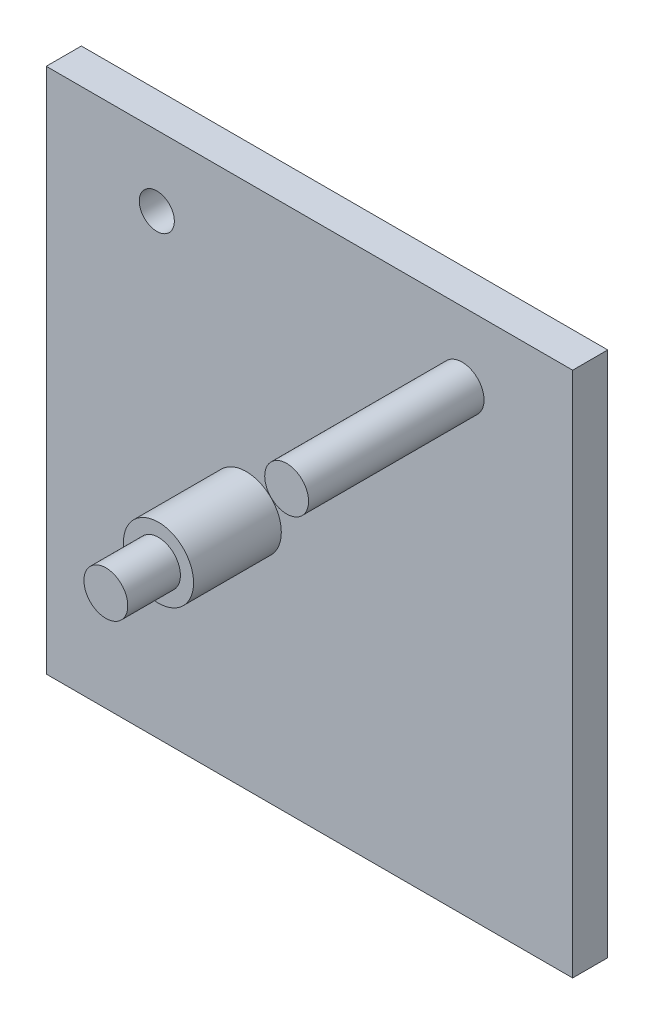
ISO-10303-21;
HEADER;
FILE_DESCRIPTION(('STEP AP214'),'2;1');
FILE_NAME('part.step','',(''),(''),'','','');
FILE_SCHEMA(('AUTOMOTIVE_DESIGN { 1 0 10303 214 1 1 1 1 }'));
ENDSEC;
DATA;
#1=APPLICATION_CONTEXT('core data for automotive mechanical design processes');
#2=APPLICATION_PROTOCOL_DEFINITION('international standard','automotive_design',2000,#1);
#3=PRODUCT_CONTEXT('',#1,'mechanical');
#4=PRODUCT('Part','Part','',(#3));
#5=PRODUCT_RELATED_PRODUCT_CATEGORY('part','',(#4));
#6=PRODUCT_DEFINITION_FORMATION('','',#4);
#7=PRODUCT_DEFINITION_CONTEXT('part definition',#1,'design');
#8=PRODUCT_DEFINITION('design','',#6,#7);
#9=PRODUCT_DEFINITION_SHAPE('','',#8);
#10=(LENGTH_UNIT() NAMED_UNIT(*) SI_UNIT(.MILLI.,.METRE.));
#11=(NAMED_UNIT(*) PLANE_ANGLE_UNIT() SI_UNIT($,.RADIAN.));
#12=(NAMED_UNIT(*) SI_UNIT($,.STERADIAN.) SOLID_ANGLE_UNIT());
#13=UNCERTAINTY_MEASURE_WITH_UNIT(LENGTH_MEASURE(1.E-05),#10,'distance_accuracy_value','');
#14=(GEOMETRIC_REPRESENTATION_CONTEXT(3) GLOBAL_UNCERTAINTY_ASSIGNED_CONTEXT((#13)) GLOBAL_UNIT_ASSIGNED_CONTEXT((#10,
#11,#12)) REPRESENTATION_CONTEXT('',''));
#15=CARTESIAN_POINT('',(0.,0.,0.));
#16=DIRECTION('',(0.,0.,1.));
#17=DIRECTION('',(1.,0.,0.));
#18=AXIS2_PLACEMENT_3D('',#15,#16,#17);
#19=CARTESIAN_POINT('',(-23.6266456506603,3.86953703698112,15.24));
#20=DIRECTION('',(0.,0.,-1.));
#21=DIRECTION('',(-1.,0.,0.));
#22=AXIS2_PLACEMENT_3D('',#19,#20,#21);
#23=CYLINDRICAL_SURFACE('',#22,1.5875);
#24=CARTESIAN_POINT('',(-23.6266456506603,3.86953703698112,8.89));
#25=DIRECTION('',(0.,0.,1.));
#26=DIRECTION('',(1.,0.,0.));
#27=AXIS2_PLACEMENT_3D('',#24,#25,#26);
#28=CIRCLE('',#27,1.5875);
#29=CARTESIAN_POINT('',(-25.2141456506603,3.86953703698112,8.89));
#30=VERTEX_POINT('',#29);
#31=EDGE_CURVE('E42',#30,#30,#28,.T.);
#32=CARTESIAN_POINT('',(-23.6266456506603,3.86953703698112,12.7));
#33=DIRECTION('',(0.,0.,1.));
#34=DIRECTION('',(1.,0.,0.));
#35=AXIS2_PLACEMENT_3D('',#32,#33,#34);
#36=CIRCLE('',#35,1.5875);
#37=CARTESIAN_POINT('',(-25.2141456506603,3.86953703698112,12.7));
#38=VERTEX_POINT('',#37);
#39=EDGE_CURVE('E150',#38,#38,#36,.T.);
#40=CARTESIAN_POINT('',(-25.2141456506603,3.86953703698112,8.89));
#41=CARTESIAN_POINT('',(-25.2141456506603,3.86953703698112,8.9296875));
#42=CARTESIAN_POINT('',(-25.2141456506603,3.86953703698112,8.969375));
#43=CARTESIAN_POINT('',(-25.2141456506603,3.86953703698112,9.04875));
#44=CARTESIAN_POINT('',(-25.2141456506603,3.86953703698112,9.0884375));
#45=CARTESIAN_POINT('',(-25.2141456506603,3.86953703698112,9.1678125));
#46=CARTESIAN_POINT('',(-25.2141456506603,3.86953703698112,9.2075));
#47=CARTESIAN_POINT('',(-25.2141456506603,3.86953703698112,9.286875));
#48=CARTESIAN_POINT('',(-25.2141456506603,3.86953703698112,9.3265625));
#49=CARTESIAN_POINT('',(-25.2141456506603,3.86953703698112,9.4059375));
#50=CARTESIAN_POINT('',(-25.2141456506603,3.86953703698112,9.445625));
#51=CARTESIAN_POINT('',(-25.2141456506603,3.86953703698112,9.525));
#52=CARTESIAN_POINT('',(-25.2141456506603,3.86953703698112,9.5646875));
#53=CARTESIAN_POINT('',(-25.2141456506603,3.86953703698112,9.6440625));
#54=CARTESIAN_POINT('',(-25.2141456506603,3.86953703698112,9.68375));
#55=CARTESIAN_POINT('',(-25.2141456506603,3.86953703698112,9.763125));
#56=CARTESIAN_POINT('',(-25.2141456506603,3.86953703698112,9.8028125));
#57=CARTESIAN_POINT('',(-25.2141456506603,3.86953703698112,9.8821875));
#58=CARTESIAN_POINT('',(-25.2141456506603,3.86953703698112,9.921875));
#59=CARTESIAN_POINT('',(-25.2141456506603,3.86953703698112,10.00125));
#60=CARTESIAN_POINT('',(-25.2141456506603,3.86953703698112,10.0409375));
#61=CARTESIAN_POINT('',(-25.2141456506603,3.86953703698112,10.1203125));
#62=CARTESIAN_POINT('',(-25.2141456506603,3.86953703698112,10.16));
#63=CARTESIAN_POINT('',(-25.2141456506603,3.86953703698112,10.239375));
#64=CARTESIAN_POINT('',(-25.2141456506603,3.86953703698112,10.2790625));
#65=CARTESIAN_POINT('',(-25.2141456506603,3.86953703698112,10.3584375));
#66=CARTESIAN_POINT('',(-25.2141456506603,3.86953703698112,10.398125));
#67=CARTESIAN_POINT('',(-25.2141456506603,3.86953703698112,10.4775));
#68=CARTESIAN_POINT('',(-25.2141456506603,3.86953703698112,10.5171875));
#69=CARTESIAN_POINT('',(-25.2141456506603,3.86953703698112,10.5965625));
#70=CARTESIAN_POINT('',(-25.2141456506603,3.86953703698112,10.63625));
#71=CARTESIAN_POINT('',(-25.2141456506603,3.86953703698112,10.715625));
#72=CARTESIAN_POINT('',(-25.2141456506603,3.86953703698112,10.7553125));
#73=CARTESIAN_POINT('',(-25.2141456506603,3.86953703698112,10.8346875));
#74=CARTESIAN_POINT('',(-25.2141456506603,3.86953703698112,10.874375));
#75=CARTESIAN_POINT('',(-25.2141456506603,3.86953703698112,10.95375));
#76=CARTESIAN_POINT('',(-25.2141456506603,3.86953703698112,10.9934375));
#77=CARTESIAN_POINT('',(-25.2141456506603,3.86953703698112,11.0728125));
#78=CARTESIAN_POINT('',(-25.2141456506603,3.86953703698112,11.1125));
#79=CARTESIAN_POINT('',(-25.2141456506603,3.86953703698112,11.191875));
#80=CARTESIAN_POINT('',(-25.2141456506603,3.86953703698112,11.2315625));
#81=CARTESIAN_POINT('',(-25.2141456506603,3.86953703698112,11.3109375));
#82=CARTESIAN_POINT('',(-25.2141456506603,3.86953703698112,11.350625));
#83=CARTESIAN_POINT('',(-25.2141456506603,3.86953703698112,11.43));
#84=CARTESIAN_POINT('',(-25.2141456506603,3.86953703698112,11.4696875));
#85=CARTESIAN_POINT('',(-25.2141456506603,3.86953703698112,11.5490625));
#86=CARTESIAN_POINT('',(-25.2141456506603,3.86953703698112,11.58875));
#87=CARTESIAN_POINT('',(-25.2141456506603,3.86953703698112,11.668125));
#88=CARTESIAN_POINT('',(-25.2141456506603,3.86953703698112,11.7078125));
#89=CARTESIAN_POINT('',(-25.2141456506603,3.86953703698112,11.7871875));
#90=CARTESIAN_POINT('',(-25.2141456506603,3.86953703698112,11.826875));
#91=CARTESIAN_POINT('',(-25.2141456506603,3.86953703698112,11.90625));
#92=CARTESIAN_POINT('',(-25.2141456506603,3.86953703698112,11.9459375));
#93=CARTESIAN_POINT('',(-25.2141456506603,3.86953703698112,12.0253125));
#94=CARTESIAN_POINT('',(-25.2141456506603,3.86953703698112,12.065));
#95=CARTESIAN_POINT('',(-25.2141456506603,3.86953703698112,12.144375));
#96=CARTESIAN_POINT('',(-25.2141456506603,3.86953703698112,12.1840625));
#97=CARTESIAN_POINT('',(-25.2141456506603,3.86953703698112,12.2634375));
#98=CARTESIAN_POINT('',(-25.2141456506603,3.86953703698112,12.303125));
#99=CARTESIAN_POINT('',(-25.2141456506603,3.86953703698112,12.3825));
#100=CARTESIAN_POINT('',(-25.2141456506603,3.86953703698112,12.4221875));
#101=CARTESIAN_POINT('',(-25.2141456506603,3.86953703698112,12.5015625));
#102=CARTESIAN_POINT('',(-25.2141456506603,3.86953703698112,12.54125));
#103=CARTESIAN_POINT('',(-25.2141456506603,3.86953703698112,12.620625));
#104=CARTESIAN_POINT('',(-25.2141456506603,3.86953703698112,12.6603125));
#105=CARTESIAN_POINT('',(-25.2141456506603,3.86953703698112,12.7));
#106=B_SPLINE_CURVE_WITH_KNOTS('',3,(#40,#41,#42,#43,#44,#45,#46,#47,#48,#49,#50,#51,#52,#53,
#54,#55,#56,#57,#58,#59,#60,#61,#62,#63,#64,#65,#66,#67,#68,#69,#70,#71,#72,#73,#74,#75,#76,#77,
#78,#79,#80,#81,#82,#83,#84,#85,#86,#87,#88,#89,#90,#91,#92,#93,#94,#95,#96,#97,#98,#99,#100,
#101,#102,#103,#104,#105),.UNSPECIFIED.,.F.,.F.,(4,2,2,2,2,2,2,2,2,2,2,2,2,2,2,2,2,2,2,2,2,2,2,
2,2,2,2,2,2,2,2,2,4),(0.,0.119062500000001,0.238125000000002,0.357187500000002,
0.476250000000001,0.5953125,0.714375000000001,0.833437500000003,0.952500000000002,1.0715625,
1.190625,1.3096875,1.42875,1.5478125,1.666875,1.7859375,1.905,2.0240625,2.143125,2.2621875,
2.38125,2.5003125,2.619375,2.7384375,2.8575,2.9765625,3.095625,3.2146875,3.33375,3.4528125,
3.571875,3.6909375,3.81),.UNSPECIFIED.);
#107=EDGE_CURVE('BSEAM38',#30,#38,#106,.T.);
#108=ORIENTED_EDGE('',*,*,#31,.T.);
#109=ORIENTED_EDGE('',*,*,#39,.F.);
#110=ORIENTED_EDGE('',*,*,#107,.T.);
#111=ORIENTED_EDGE('',*,*,#107,.F.);
#112=EDGE_LOOP('',(#108,#110,#109,#111));
#113=FACE_BOUND('',#112,.T.);
#114=ADVANCED_FACE('F38',(#113),#23,.T.);
#115=CARTESIAN_POINT('',(0.,-13.5248173123585,2.54));
#116=DIRECTION('',(-1.,0.,0.));
#117=DIRECTION('',(0.,-1.,0.));
#118=AXIS2_PLACEMENT_3D('',#115,#116,#117);
#119=PLANE('',#118);
#120=DIRECTION('',(0.,1.,0.));
#121=VECTOR('',#120,1.);
#122=CARTESIAN_POINT('',(0.,-13.5248173123585,0.));
#123=LINE('',#122,#121);
#124=CARTESIAN_POINT('',(0.,-13.5248173123585,0.));
#125=VERTEX_POINT('',#124);
#126=CARTESIAN_POINT('',(0.,24.5751826876415,0.));
#127=VERTEX_POINT('',#126);
#128=EDGE_CURVE('E109',#125,#127,#123,.T.);
#129=ORIENTED_EDGE('',*,*,#128,.T.);
#130=DIRECTION('',(0.,0.,-1.));
#131=VECTOR('',#130,1.);
#132=CARTESIAN_POINT('',(0.,24.5751826876415,2.54));
#133=LINE('',#132,#131);
#134=CARTESIAN_POINT('',(0.,24.5751826876415,2.54));
#135=VERTEX_POINT('',#134);
#136=EDGE_CURVE('E11',#135,#127,#133,.T.);
#137=ORIENTED_EDGE('',*,*,#136,.F.);
#138=DIRECTION('',(0.,1.,0.));
#139=VECTOR('',#138,1.);
#140=CARTESIAN_POINT('',(0.,-13.5248173123585,2.54));
#141=LINE('',#140,#139);
#142=CARTESIAN_POINT('',(0.,-13.5248173123585,2.54));
#143=VERTEX_POINT('',#142);
#144=EDGE_CURVE('E92',#143,#135,#141,.T.);
#145=ORIENTED_EDGE('',*,*,#144,.F.);
#146=DIRECTION('',(0.,0.,-1.));
#147=VECTOR('',#146,1.);
#148=CARTESIAN_POINT('',(0.,-13.5248173123585,2.54));
#149=LINE('',#148,#147);
#150=EDGE_CURVE('E105',#143,#125,#149,.T.);
#151=ORIENTED_EDGE('',*,*,#150,.T.);
#152=EDGE_LOOP('',(#129,#137,#145,#151));
#153=FACE_BOUND('',#152,.T.);
#154=ADVANCED_FACE('F40',(#153),#119,.F.);
#155=CARTESIAN_POINT('',(0.,24.5751826876415,2.54));
#156=DIRECTION('',(0.,-1.,0.));
#157=DIRECTION('',(1.,0.,0.));
#158=AXIS2_PLACEMENT_3D('',#155,#156,#157);
#159=PLANE('',#158);
#160=DIRECTION('',(-1.,0.,0.));
#161=VECTOR('',#160,1.);
#162=CARTESIAN_POINT('',(0.,24.5751826876415,0.));
#163=LINE('',#162,#161);
#164=CARTESIAN_POINT('',(-38.1,24.5751826876415,0.));
#165=VERTEX_POINT('',#164);
#166=EDGE_CURVE('E97',#127,#165,#163,.T.);
#167=ORIENTED_EDGE('',*,*,#166,.T.);
#168=DIRECTION('',(0.,0.,-1.));
#169=VECTOR('',#168,1.);
#170=CARTESIAN_POINT('',(-38.1,24.5751826876415,2.54));
#171=LINE('',#170,#169);
#172=CARTESIAN_POINT('',(-38.1,24.5751826876415,2.54));
#173=VERTEX_POINT('',#172);
#174=EDGE_CURVE('E49',#173,#165,#171,.T.);
#175=ORIENTED_EDGE('',*,*,#174,.F.);
#176=DIRECTION('',(-1.,0.,0.));
#177=VECTOR('',#176,1.);
#178=CARTESIAN_POINT('',(0.,24.5751826876415,2.54));
#179=LINE('',#178,#177);
#180=EDGE_CURVE('E87',#135,#173,#179,.T.);
#181=ORIENTED_EDGE('',*,*,#180,.F.);
#182=ORIENTED_EDGE('',*,*,#136,.T.);
#183=EDGE_LOOP('',(#167,#175,#181,#182));
#184=FACE_BOUND('',#183,.T.);
#185=ADVANCED_FACE('F96',(#184),#159,.F.);
#186=CARTESIAN_POINT('',(-38.1,24.5751826876415,2.54));
#187=DIRECTION('',(1.,0.,0.));
#188=DIRECTION('',(0.,1.,0.));
#189=AXIS2_PLACEMENT_3D('',#186,#187,#188);
#190=PLANE('',#189);
#191=DIRECTION('',(0.,-1.,0.));
#192=VECTOR('',#191,1.);
#193=CARTESIAN_POINT('',(-38.1,24.5751826876415,0.));
#194=LINE('',#193,#192);
#195=CARTESIAN_POINT('',(-38.1,-13.5248173123586,0.));
#196=VERTEX_POINT('',#195);
#197=EDGE_CURVE('E74',#165,#196,#194,.T.);
#198=ORIENTED_EDGE('',*,*,#197,.T.);
#199=DIRECTION('',(0.,0.,-1.));
#200=VECTOR('',#199,1.);
#201=CARTESIAN_POINT('',(-38.1,-13.5248173123586,2.54));
#202=LINE('',#201,#200);
#203=CARTESIAN_POINT('',(-38.1,-13.5248173123586,2.54));
#204=VERTEX_POINT('',#203);
#205=EDGE_CURVE('E99',#204,#196,#202,.T.);
#206=ORIENTED_EDGE('',*,*,#205,.F.);
#207=DIRECTION('',(0.,-1.,0.));
#208=VECTOR('',#207,1.);
#209=CARTESIAN_POINT('',(-38.1,24.5751826876415,2.54));
#210=LINE('',#209,#208);
#211=EDGE_CURVE('E90',#173,#204,#210,.T.);
#212=ORIENTED_EDGE('',*,*,#211,.F.);
#213=ORIENTED_EDGE('',*,*,#174,.T.);
#214=EDGE_LOOP('',(#198,#206,#212,#213));
#215=FACE_BOUND('',#214,.T.);
#216=ADVANCED_FACE('F101',(#215),#190,.F.);
#217=CARTESIAN_POINT('',(-38.1,-13.5248173123586,2.54));
#218=DIRECTION('',(0.,1.,0.));
#219=DIRECTION('',(-1.,0.,0.));
#220=AXIS2_PLACEMENT_3D('',#217,#218,#219);
#221=PLANE('',#220);
#222=DIRECTION('',(1.,0.,0.));
#223=VECTOR('',#222,1.);
#224=CARTESIAN_POINT('',(-38.1,-13.5248173123586,0.));
#225=LINE('',#224,#223);
#226=EDGE_CURVE('E80',#196,#125,#225,.T.);
#227=ORIENTED_EDGE('',*,*,#226,.T.);
#228=ORIENTED_EDGE('',*,*,#150,.F.);
#229=DIRECTION('',(1.,0.,0.));
#230=VECTOR('',#229,1.);
#231=CARTESIAN_POINT('',(-38.1,-13.5248173123586,2.54));
#232=LINE('',#231,#230);
#233=EDGE_CURVE('E57',#204,#143,#232,.T.);
#234=ORIENTED_EDGE('',*,*,#233,.F.);
#235=ORIENTED_EDGE('',*,*,#205,.T.);
#236=EDGE_LOOP('',(#227,#228,#234,#235));
#237=FACE_BOUND('',#236,.T.);
#238=ADVANCED_FACE('F123',(#237),#221,.F.);
#239=CARTESIAN_POINT('',(0.,0.,2.54));
#240=DIRECTION('',(0.,0.,1.));
#241=DIRECTION('',(1.,0.,0.));
#242=AXIS2_PLACEMENT_3D('',#239,#240,#241);
#243=PLANE('',#242);
#244=CARTESIAN_POINT('',(-23.6266456506603,3.86953703698112,2.54));
#245=DIRECTION('',(0.,0.,1.));
#246=DIRECTION('',(1.,0.,0.));
#247=AXIS2_PLACEMENT_3D('',#244,#245,#246);
#248=CIRCLE('',#247,2.54);
#249=CARTESIAN_POINT('',(-21.0866456506603,3.86953703698112,2.54));
#250=VERTEX_POINT('',#249);
#251=EDGE_CURVE('E145',#250,#250,#248,.T.);
#252=ORIENTED_EDGE('',*,*,#251,.F.);
#253=EDGE_LOOP('',(#252));
#254=FACE_BOUND('',#253,.T.);
#255=CARTESIAN_POINT('',(-30.099,19.4951826876414,2.54));
#256=DIRECTION('',(0.,0.,1.));
#257=DIRECTION('',(1.,0.,0.));
#258=AXIS2_PLACEMENT_3D('',#255,#256,#257);
#259=CIRCLE('',#258,1.27);
#260=CARTESIAN_POINT('',(-28.829,19.4951826876414,2.54));
#261=VERTEX_POINT('',#260);
#262=EDGE_CURVE('E134',#261,#261,#259,.T.);
#263=ORIENTED_EDGE('',*,*,#262,.F.);
#264=EDGE_LOOP('',(#263));
#265=FACE_BOUND('',#264,.T.);
#266=CARTESIAN_POINT('',(-8.00100000000002,19.4951826876415,2.54));
#267=DIRECTION('',(0.,0.,1.));
#268=DIRECTION('',(1.,0.,0.));
#269=AXIS2_PLACEMENT_3D('',#266,#267,#268);
#270=CIRCLE('',#269,1.5875);
#271=CARTESIAN_POINT('',(-9.58850000000002,19.4951826876415,2.54));
#272=VERTEX_POINT('',#271);
#273=EDGE_CURVE('E130',#272,#272,#270,.T.);
#274=ORIENTED_EDGE('',*,*,#273,.F.);
#275=EDGE_LOOP('',(#274));
#276=FACE_BOUND('',#275,.T.);
#277=ORIENTED_EDGE('',*,*,#144,.T.);
#278=ORIENTED_EDGE('',*,*,#180,.T.);
#279=ORIENTED_EDGE('',*,*,#211,.T.);
#280=ORIENTED_EDGE('',*,*,#233,.T.);
#281=EDGE_LOOP('',(#277,#278,#279,#280));
#282=FACE_BOUND('',#281,.T.);
#283=ADVANCED_FACE('F88',(#254,#265,#276,#282),#243,.T.);
#284=CARTESIAN_POINT('',(0.,0.,0.));
#285=DIRECTION('',(0.,0.,1.));
#286=DIRECTION('',(1.,0.,0.));
#287=AXIS2_PLACEMENT_3D('',#284,#285,#286);
#288=PLANE('',#287);
#289=CARTESIAN_POINT('',(-30.099,19.4951826876414,0.));
#290=DIRECTION('',(0.,0.,1.));
#291=DIRECTION('',(1.,0.,0.));
#292=AXIS2_PLACEMENT_3D('',#289,#290,#291);
#293=CIRCLE('',#292,1.27);
#294=CARTESIAN_POINT('',(-28.829,19.4951826876414,0.));
#295=VERTEX_POINT('',#294);
#296=EDGE_CURVE('E141',#295,#295,#293,.T.);
#297=ORIENTED_EDGE('',*,*,#296,.T.);
#298=EDGE_LOOP('',(#297));
#299=FACE_BOUND('',#298,.T.);
#300=ORIENTED_EDGE('',*,*,#128,.F.);
#301=ORIENTED_EDGE('',*,*,#226,.F.);
#302=ORIENTED_EDGE('',*,*,#197,.F.);
#303=ORIENTED_EDGE('',*,*,#166,.F.);
#304=EDGE_LOOP('',(#300,#301,#302,#303));
#305=FACE_BOUND('',#304,.T.);
#306=ADVANCED_FACE('F126',(#299,#305),#288,.F.);
#307=CARTESIAN_POINT('',(-8.00100000000002,19.4951826876415,15.24));
#308=DIRECTION('',(0.,0.,-1.));
#309=DIRECTION('',(-1.,0.,0.));
#310=AXIS2_PLACEMENT_3D('',#307,#308,#309);
#311=CYLINDRICAL_SURFACE('',#310,1.5875);
#312=CARTESIAN_POINT('',(-8.00100000000002,19.4951826876415,15.24));
#313=DIRECTION('',(0.,0.,1.));
#314=DIRECTION('',(1.,0.,0.));
#315=AXIS2_PLACEMENT_3D('',#312,#313,#314);
#316=CIRCLE('',#315,1.5875);
#317=CARTESIAN_POINT('',(-9.58850000000002,19.4951826876415,15.24));
#318=VERTEX_POINT('',#317);
#319=EDGE_CURVE('E113',#318,#318,#316,.T.);
#320=CARTESIAN_POINT('',(-9.58850000000002,19.4951826876415,15.24));
#321=CARTESIAN_POINT('',(-9.58850000000002,19.4951826876415,15.1077083333333));
#322=CARTESIAN_POINT('',(-9.58850000000002,19.4951826876415,14.9754166666667));
#323=CARTESIAN_POINT('',(-9.58850000000002,19.4951826876415,14.7108333333333));
#324=CARTESIAN_POINT('',(-9.58850000000002,19.4951826876415,14.5785416666667));
#325=CARTESIAN_POINT('',(-9.58850000000002,19.4951826876415,14.3139583333333));
#326=CARTESIAN_POINT('',(-9.58850000000002,19.4951826876415,14.1816666666667));
#327=CARTESIAN_POINT('',(-9.58850000000002,19.4951826876415,13.9170833333333));
#328=CARTESIAN_POINT('',(-9.58850000000002,19.4951826876415,13.7847916666667));
#329=CARTESIAN_POINT('',(-9.58850000000002,19.4951826876415,13.5202083333333));
#330=CARTESIAN_POINT('',(-9.58850000000002,19.4951826876415,13.3879166666667));
#331=CARTESIAN_POINT('',(-9.58850000000002,19.4951826876415,13.1233333333333));
#332=CARTESIAN_POINT('',(-9.58850000000002,19.4951826876415,12.9910416666667));
#333=CARTESIAN_POINT('',(-9.58850000000002,19.4951826876415,12.7264583333333));
#334=CARTESIAN_POINT('',(-9.58850000000002,19.4951826876415,12.5941666666667));
#335=CARTESIAN_POINT('',(-9.58850000000002,19.4951826876415,12.3295833333333));
#336=CARTESIAN_POINT('',(-9.58850000000002,19.4951826876415,12.1972916666667));
#337=CARTESIAN_POINT('',(-9.58850000000002,19.4951826876415,11.9327083333333));
#338=CARTESIAN_POINT('',(-9.58850000000002,19.4951826876415,11.8004166666667));
#339=CARTESIAN_POINT('',(-9.58850000000002,19.4951826876415,11.5358333333333));
#340=CARTESIAN_POINT('',(-9.58850000000002,19.4951826876415,11.4035416666667));
#341=CARTESIAN_POINT('',(-9.58850000000002,19.4951826876415,11.1389583333333));
#342=CARTESIAN_POINT('',(-9.58850000000002,19.4951826876415,11.0066666666667));
#343=CARTESIAN_POINT('',(-9.58850000000002,19.4951826876415,10.7420833333333));
#344=CARTESIAN_POINT('',(-9.58850000000002,19.4951826876415,10.6097916666667));
#345=CARTESIAN_POINT('',(-9.58850000000002,19.4951826876415,10.3452083333333));
#346=CARTESIAN_POINT('',(-9.58850000000002,19.4951826876415,10.2129166666667));
#347=CARTESIAN_POINT('',(-9.58850000000002,19.4951826876415,9.94833333333334));
#348=CARTESIAN_POINT('',(-9.58850000000002,19.4951826876415,9.81604166666667));
#349=CARTESIAN_POINT('',(-9.58850000000002,19.4951826876415,9.55145833333333));
#350=CARTESIAN_POINT('',(-9.58850000000002,19.4951826876415,9.41916666666667));
#351=CARTESIAN_POINT('',(-9.58850000000002,19.4951826876415,9.15458333333333));
#352=CARTESIAN_POINT('',(-9.58850000000002,19.4951826876415,9.02229166666667));
#353=CARTESIAN_POINT('',(-9.58850000000002,19.4951826876415,8.75770833333334));
#354=CARTESIAN_POINT('',(-9.58850000000002,19.4951826876415,8.62541666666667));
#355=CARTESIAN_POINT('',(-9.58850000000002,19.4951826876415,8.36083333333333));
#356=CARTESIAN_POINT('',(-9.58850000000002,19.4951826876415,8.22854166666667));
#357=CARTESIAN_POINT('',(-9.58850000000002,19.4951826876415,7.96395833333333));
#358=CARTESIAN_POINT('',(-9.58850000000002,19.4951826876415,7.83166666666667));
#359=CARTESIAN_POINT('',(-9.58850000000002,19.4951826876415,7.56708333333333));
#360=CARTESIAN_POINT('',(-9.58850000000002,19.4951826876415,7.43479166666667));
#361=CARTESIAN_POINT('',(-9.58850000000002,19.4951826876415,7.17020833333333));
#362=CARTESIAN_POINT('',(-9.58850000000002,19.4951826876415,7.03791666666667));
#363=CARTESIAN_POINT('',(-9.58850000000002,19.4951826876415,6.77333333333334));
#364=CARTESIAN_POINT('',(-9.58850000000002,19.4951826876415,6.64104166666667));
#365=CARTESIAN_POINT('',(-9.58850000000002,19.4951826876415,6.37645833333333));
#366=CARTESIAN_POINT('',(-9.58850000000002,19.4951826876415,6.24416666666667));
#367=CARTESIAN_POINT('',(-9.58850000000002,19.4951826876415,5.97958333333333));
#368=CARTESIAN_POINT('',(-9.58850000000002,19.4951826876415,5.84729166666667));
#369=CARTESIAN_POINT('',(-9.58850000000002,19.4951826876415,5.58270833333333));
#370=CARTESIAN_POINT('',(-9.58850000000002,19.4951826876415,5.45041666666667));
#371=CARTESIAN_POINT('',(-9.58850000000002,19.4951826876415,5.18583333333333));
#372=CARTESIAN_POINT('',(-9.58850000000002,19.4951826876415,5.05354166666667));
#373=CARTESIAN_POINT('',(-9.58850000000002,19.4951826876415,4.78895833333334));
#374=CARTESIAN_POINT('',(-9.58850000000002,19.4951826876415,4.65666666666667));
#375=CARTESIAN_POINT('',(-9.58850000000002,19.4951826876415,4.39208333333333));
#376=CARTESIAN_POINT('',(-9.58850000000002,19.4951826876415,4.25979166666667));
#377=CARTESIAN_POINT('',(-9.58850000000002,19.4951826876415,3.99520833333333));
#378=CARTESIAN_POINT('',(-9.58850000000002,19.4951826876415,3.86291666666667));
#379=CARTESIAN_POINT('',(-9.58850000000002,19.4951826876415,3.59833333333333));
#380=CARTESIAN_POINT('',(-9.58850000000002,19.4951826876415,3.46604166666667));
#381=CARTESIAN_POINT('',(-9.58850000000002,19.4951826876415,3.20145833333333));
#382=CARTESIAN_POINT('',(-9.58850000000002,19.4951826876415,3.06916666666667));
#383=CARTESIAN_POINT('',(-9.58850000000002,19.4951826876415,2.80458333333333));
#384=CARTESIAN_POINT('',(-9.58850000000002,19.4951826876415,2.67229166666667));
#385=CARTESIAN_POINT('',(-9.58850000000002,19.4951826876415,2.54));
#386=B_SPLINE_CURVE_WITH_KNOTS('',3,(#320,#321,#322,#323,#324,#325,#326,#327,#328,#329,#330,
#331,#332,#333,#334,#335,#336,#337,#338,#339,#340,#341,#342,#343,#344,#345,#346,#347,#348,#349,
#350,#351,#352,#353,#354,#355,#356,#357,#358,#359,#360,#361,#362,#363,#364,#365,#366,#367,#368,
#369,#370,#371,#372,#373,#374,#375,#376,#377,#378,#379,#380,#381,#382,#383,#384,#385),
.UNSPECIFIED.,.F.,.F.,(4,2,2,2,2,2,2,2,2,2,2,2,2,2,2,2,2,2,2,2,2,2,2,2,2,2,2,2,2,2,2,2,4),(0.,
0.396875000000001,0.793750000000001,1.190625,1.5875,1.984375,2.38125,2.778125,3.175,3.571875,
3.96875,4.365625,4.7625,5.159375,5.55625,5.953125,6.35,6.746875,7.14375,7.540625,7.9375,
8.334375,8.73125,9.128125,9.525,9.921875,10.31875,10.715625,11.1125,11.509375,11.90625,
12.303125,12.7),.UNSPECIFIED.);
#387=EDGE_CURVE('BSEAM176',#318,#272,#386,.T.);
#388=ORIENTED_EDGE('',*,*,#319,.F.);
#389=ORIENTED_EDGE('',*,*,#273,.T.);
#390=ORIENTED_EDGE('',*,*,#387,.T.);
#391=ORIENTED_EDGE('',*,*,#387,.F.);
#392=EDGE_LOOP('',(#388,#390,#389,#391));
#393=FACE_BOUND('',#392,.T.);
#394=ADVANCED_FACE('F176',(#393),#311,.T.);
#395=CARTESIAN_POINT('',(-8.00100000000002,19.4951826876415,15.24));
#396=DIRECTION('',(0.,0.,1.));
#397=DIRECTION('',(1.,0.,0.));
#398=AXIS2_PLACEMENT_3D('',#395,#396,#397);
#399=PLANE('',#398);
#400=ORIENTED_EDGE('',*,*,#319,.T.);
#401=EDGE_LOOP('',(#400));
#402=FACE_BOUND('',#401,.T.);
#403=ADVANCED_FACE('F173',(#402),#399,.T.);
#404=CARTESIAN_POINT('',(-30.099,19.4951826876414,0.));
#405=DIRECTION('',(0.,0.,1.));
#406=DIRECTION('',(1.,0.,0.));
#407=AXIS2_PLACEMENT_3D('',#404,#405,#406);
#408=CYLINDRICAL_SURFACE('',#407,1.27);
#409=CARTESIAN_POINT('',(-28.829,19.4951826876414,2.54));
#410=CARTESIAN_POINT('',(-28.829,19.4951826876414,2.51354166666667));
#411=CARTESIAN_POINT('',(-28.829,19.4951826876414,2.48708333333333));
#412=CARTESIAN_POINT('',(-28.829,19.4951826876414,2.43416666666667));
#413=CARTESIAN_POINT('',(-28.829,19.4951826876414,2.40770833333333));
#414=CARTESIAN_POINT('',(-28.829,19.4951826876414,2.35479166666667));
#415=CARTESIAN_POINT('',(-28.829,19.4951826876414,2.32833333333333));
#416=CARTESIAN_POINT('',(-28.829,19.4951826876414,2.27541666666667));
#417=CARTESIAN_POINT('',(-28.829,19.4951826876414,2.24895833333333));
#418=CARTESIAN_POINT('',(-28.829,19.4951826876414,2.19604166666667));
#419=CARTESIAN_POINT('',(-28.829,19.4951826876414,2.16958333333333));
#420=CARTESIAN_POINT('',(-28.829,19.4951826876414,2.11666666666667));
#421=CARTESIAN_POINT('',(-28.829,19.4951826876414,2.09020833333333));
#422=CARTESIAN_POINT('',(-28.829,19.4951826876414,2.03729166666667));
#423=CARTESIAN_POINT('',(-28.829,19.4951826876414,2.01083333333333));
#424=CARTESIAN_POINT('',(-28.829,19.4951826876414,1.95791666666667));
#425=CARTESIAN_POINT('',(-28.829,19.4951826876414,1.93145833333333));
#426=CARTESIAN_POINT('',(-28.829,19.4951826876414,1.87854166666667));
#427=CARTESIAN_POINT('',(-28.829,19.4951826876414,1.85208333333333));
#428=CARTESIAN_POINT('',(-28.829,19.4951826876414,1.79916666666667));
#429=CARTESIAN_POINT('',(-28.829,19.4951826876414,1.77270833333333));
#430=CARTESIAN_POINT('',(-28.829,19.4951826876414,1.71979166666667));
#431=CARTESIAN_POINT('',(-28.829,19.4951826876414,1.69333333333333));
#432=CARTESIAN_POINT('',(-28.829,19.4951826876414,1.64041666666667));
#433=CARTESIAN_POINT('',(-28.829,19.4951826876414,1.61395833333333));
#434=CARTESIAN_POINT('',(-28.829,19.4951826876414,1.56104166666667));
#435=CARTESIAN_POINT('',(-28.829,19.4951826876414,1.53458333333333));
#436=CARTESIAN_POINT('',(-28.829,19.4951826876414,1.48166666666667));
#437=CARTESIAN_POINT('',(-28.829,19.4951826876414,1.45520833333333));
#438=CARTESIAN_POINT('',(-28.829,19.4951826876414,1.40229166666667));
#439=CARTESIAN_POINT('',(-28.829,19.4951826876414,1.37583333333333));
#440=CARTESIAN_POINT('',(-28.829,19.4951826876414,1.32291666666667));
#441=CARTESIAN_POINT('',(-28.829,19.4951826876414,1.29645833333333));
#442=CARTESIAN_POINT('',(-28.829,19.4951826876414,1.24354166666667));
#443=CARTESIAN_POINT('',(-28.829,19.4951826876414,1.21708333333333));
#444=CARTESIAN_POINT('',(-28.829,19.4951826876414,1.16416666666667));
#445=CARTESIAN_POINT('',(-28.829,19.4951826876414,1.13770833333333));
#446=CARTESIAN_POINT('',(-28.829,19.4951826876414,1.08479166666667));
#447=CARTESIAN_POINT('',(-28.829,19.4951826876414,1.05833333333333));
#448=CARTESIAN_POINT('',(-28.829,19.4951826876414,1.00541666666667));
#449=CARTESIAN_POINT('',(-28.829,19.4951826876414,0.978958333333333));
#450=CARTESIAN_POINT('',(-28.829,19.4951826876414,0.926041666666667));
#451=CARTESIAN_POINT('',(-28.829,19.4951826876414,0.899583333333333));
#452=CARTESIAN_POINT('',(-28.829,19.4951826876414,0.846666666666667));
#453=CARTESIAN_POINT('',(-28.829,19.4951826876414,0.820208333333333));
#454=CARTESIAN_POINT('',(-28.829,19.4951826876414,0.767291666666667));
#455=CARTESIAN_POINT('',(-28.829,19.4951826876414,0.740833333333333));
#456=CARTESIAN_POINT('',(-28.829,19.4951826876414,0.687916666666667));
#457=CARTESIAN_POINT('',(-28.829,19.4951826876414,0.661458333333333));
#458=CARTESIAN_POINT('',(-28.829,19.4951826876414,0.608541666666667));
#459=CARTESIAN_POINT('',(-28.829,19.4951826876414,0.582083333333333));
#460=CARTESIAN_POINT('',(-28.829,19.4951826876414,0.529166666666667));
#461=CARTESIAN_POINT('',(-28.829,19.4951826876414,0.502708333333333));
#462=CARTESIAN_POINT('',(-28.829,19.4951826876414,0.449791666666667));
#463=CARTESIAN_POINT('',(-28.829,19.4951826876414,0.423333333333333));
#464=CARTESIAN_POINT('',(-28.829,19.4951826876414,0.370416666666667));
#465=CARTESIAN_POINT('',(-28.829,19.4951826876414,0.343958333333333));
#466=CARTESIAN_POINT('',(-28.829,19.4951826876414,0.291041666666667));
#467=CARTESIAN_POINT('',(-28.829,19.4951826876414,0.264583333333333));
#468=CARTESIAN_POINT('',(-28.829,19.4951826876414,0.211666666666667));
#469=CARTESIAN_POINT('',(-28.829,19.4951826876414,0.185208333333333));
#470=CARTESIAN_POINT('',(-28.829,19.4951826876414,0.132291666666667));
#471=CARTESIAN_POINT('',(-28.829,19.4951826876414,0.105833333333333));
#472=CARTESIAN_POINT('',(-28.829,19.4951826876414,0.0529166666666667));
#473=CARTESIAN_POINT('',(-28.829,19.4951826876414,0.0264583333333333));
#474=CARTESIAN_POINT('',(-28.829,19.4951826876414,0.));
#475=B_SPLINE_CURVE_WITH_KNOTS('',3,(#409,#410,#411,#412,#413,#414,#415,#416,#417,#418,#419,
#420,#421,#422,#423,#424,#425,#426,#427,#428,#429,#430,#431,#432,#433,#434,#435,#436,#437,#438,
#439,#440,#441,#442,#443,#444,#445,#446,#447,#448,#449,#450,#451,#452,#453,#454,#455,#456,#457,
#458,#459,#460,#461,#462,#463,#464,#465,#466,#467,#468,#469,#470,#471,#472,#473,#474),
.UNSPECIFIED.,.F.,.F.,(4,2,2,2,2,2,2,2,2,2,2,2,2,2,2,2,2,2,2,2,2,2,2,2,2,2,2,2,2,2,2,2,4),(0.,
0.079375,0.15875,0.238125,0.3175,0.396875,0.47625,0.555625,0.635,0.714375,0.79375,0.873125,
0.9525,1.031875,1.11125,1.190625,1.27,1.349375,1.42875,1.508125,1.5875,1.666875,1.74625,
1.825625,1.905,1.984375,2.06375,2.143125,2.2225,2.301875,2.38125,2.460625,2.54),.UNSPECIFIED.);
#476=EDGE_CURVE('BSEAM171',#261,#295,#475,.T.);
#477=ORIENTED_EDGE('',*,*,#262,.T.);
#478=ORIENTED_EDGE('',*,*,#296,.F.);
#479=ORIENTED_EDGE('',*,*,#476,.T.);
#480=ORIENTED_EDGE('',*,*,#476,.F.);
#481=EDGE_LOOP('',(#477,#479,#478,#480));
#482=FACE_BOUND('',#481,.T.);
#483=ADVANCED_FACE('F171',(#482),#408,.F.);
#484=CARTESIAN_POINT('',(-23.6266456506603,3.86953703698112,8.89));
#485=DIRECTION('',(0.,0.,-1.));
#486=DIRECTION('',(-1.,0.,0.));
#487=AXIS2_PLACEMENT_3D('',#484,#485,#486);
#488=CYLINDRICAL_SURFACE('',#487,2.54);
#489=CARTESIAN_POINT('',(-23.6266456506603,3.86953703698112,8.89));
#490=DIRECTION('',(0.,0.,1.));
#491=DIRECTION('',(1.,0.,0.));
#492=AXIS2_PLACEMENT_3D('',#489,#490,#491);
#493=CIRCLE('',#492,2.54);
#494=CARTESIAN_POINT('',(-21.0866456506603,3.86953703698112,8.89));
#495=VERTEX_POINT('',#494);
#496=EDGE_CURVE('E149',#495,#495,#493,.T.);
#497=ORIENTED_EDGE('',*,*,#496,.F.);
#498=EDGE_LOOP('',(#497));
#499=FACE_BOUND('',#498,.T.);
#500=ORIENTED_EDGE('',*,*,#251,.T.);
#501=EDGE_LOOP('',(#500));
#502=FACE_BOUND('',#501,.T.);
#503=ADVANCED_FACE('F228',(#499,#502),#488,.T.);
#504=CARTESIAN_POINT('',(-23.6266456506603,3.86953703698112,8.89));
#505=DIRECTION('',(0.,0.,1.));
#506=DIRECTION('',(1.,0.,0.));
#507=AXIS2_PLACEMENT_3D('',#504,#505,#506);
#508=PLANE('',#507);
#509=ORIENTED_EDGE('',*,*,#31,.F.);
#510=EDGE_LOOP('',(#509));
#511=FACE_BOUND('',#510,.T.);
#512=ORIENTED_EDGE('',*,*,#496,.T.);
#513=EDGE_LOOP('',(#512));
#514=FACE_BOUND('',#513,.T.);
#515=ADVANCED_FACE('F234',(#511,#514),#508,.T.);
#516=CARTESIAN_POINT('',(-23.6266456506603,3.86953703698112,12.7));
#517=DIRECTION('',(0.,0.,1.));
#518=DIRECTION('',(1.,0.,0.));
#519=AXIS2_PLACEMENT_3D('',#516,#517,#518);
#520=PLANE('',#519);
#521=ORIENTED_EDGE('',*,*,#39,.T.);
#522=EDGE_LOOP('',(#521));
#523=FACE_BOUND('',#522,.T.);
#524=ADVANCED_FACE('F158',(#523),#520,.T.);
#525=CLOSED_SHELL('',(#114,#154,#185,#216,#238,#283,#306,#394,#403,#483,#503,#515,#524));
#526=MANIFOLD_SOLID_BREP('B2',#525);
#527=ADVANCED_BREP_SHAPE_REPRESENTATION('',(#18,#526),#14);
#528=SHAPE_DEFINITION_REPRESENTATION(#9,#527);
ENDSEC;
END-ISO-10303-21;
